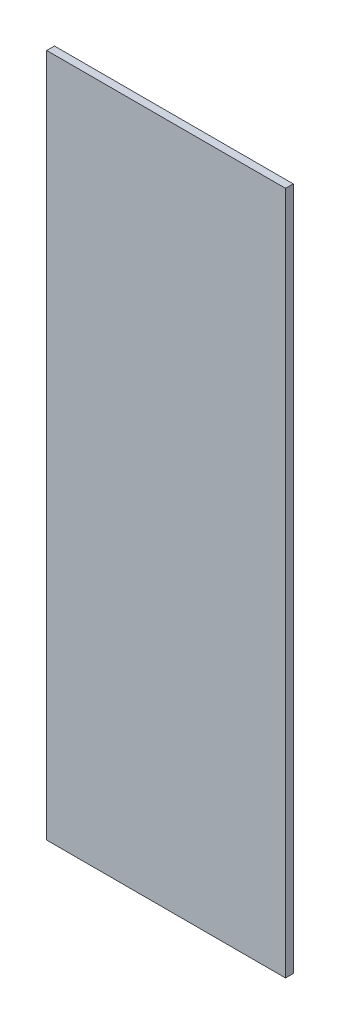
ISO-10303-21;
HEADER;
FILE_DESCRIPTION(('STEP AP214'),'2;1');
FILE_NAME('part.step','',(''),(''),'','','');
FILE_SCHEMA(('AUTOMOTIVE_DESIGN { 1 0 10303 214 1 1 1 1 }'));
ENDSEC;
DATA;
#1=APPLICATION_CONTEXT('core data for automotive mechanical design processes');
#2=APPLICATION_PROTOCOL_DEFINITION('international standard','automotive_design',2000,#1);
#3=PRODUCT_CONTEXT('',#1,'mechanical');
#4=PRODUCT('Part','Part','',(#3));
#5=PRODUCT_RELATED_PRODUCT_CATEGORY('part','',(#4));
#6=PRODUCT_DEFINITION_FORMATION('','',#4);
#7=PRODUCT_DEFINITION_CONTEXT('part definition',#1,'design');
#8=PRODUCT_DEFINITION('design','',#6,#7);
#9=PRODUCT_DEFINITION_SHAPE('','',#8);
#10=(LENGTH_UNIT() NAMED_UNIT(*) SI_UNIT(.MILLI.,.METRE.));
#11=(NAMED_UNIT(*) PLANE_ANGLE_UNIT() SI_UNIT($,.RADIAN.));
#12=(NAMED_UNIT(*) SI_UNIT($,.STERADIAN.) SOLID_ANGLE_UNIT());
#13=UNCERTAINTY_MEASURE_WITH_UNIT(LENGTH_MEASURE(1.E-05),#10,'distance_accuracy_value','');
#14=(GEOMETRIC_REPRESENTATION_CONTEXT(3) GLOBAL_UNCERTAINTY_ASSIGNED_CONTEXT((#13)) GLOBAL_UNIT_ASSIGNED_CONTEXT((#10,
#11,#12)) REPRESENTATION_CONTEXT('',''));
#15=CARTESIAN_POINT('',(0.,0.,0.));
#16=DIRECTION('',(0.,0.,1.));
#17=DIRECTION('',(1.,0.,0.));
#18=AXIS2_PLACEMENT_3D('',#15,#16,#17);
#19=CARTESIAN_POINT('',(41.5,201.5,-818.5));
#20=DIRECTION('',(-1.,0.,0.));
#21=DIRECTION('',(0.,0.,1.));
#22=AXIS2_PLACEMENT_3D('',#19,#20,#21);
#23=PLANE('',#22);
#24=DIRECTION('',(0.,-1.,0.));
#25=VECTOR('',#24,1.);
#26=CARTESIAN_POINT('',(41.5,201.5,-798.5));
#27=LINE('',#26,#25);
#28=CARTESIAN_POINT('',(41.5,1968.5,-798.5));
#29=VERTEX_POINT('',#28);
#30=CARTESIAN_POINT('',(41.5,201.5,-798.5));
#31=VERTEX_POINT('',#30);
#32=EDGE_CURVE('E103',#29,#31,#27,.T.);
#33=ORIENTED_EDGE('',*,*,#32,.F.);
#34=DIRECTION('',(0.,0.,1.));
#35=VECTOR('',#34,1.);
#36=CARTESIAN_POINT('',(41.5,1968.5,-818.5));
#37=LINE('',#36,#35);
#38=CARTESIAN_POINT('',(41.5,1968.5,-818.5));
#39=VERTEX_POINT('',#38);
#40=EDGE_CURVE('E11',#39,#29,#37,.T.);
#41=ORIENTED_EDGE('',*,*,#40,.F.);
#42=DIRECTION('',(0.,-1.,0.));
#43=VECTOR('',#42,1.);
#44=CARTESIAN_POINT('',(41.5,201.5,-818.5));
#45=LINE('',#44,#43);
#46=CARTESIAN_POINT('',(41.5,201.5,-818.5));
#47=VERTEX_POINT('',#46);
#48=EDGE_CURVE('E97',#39,#47,#45,.T.);
#49=ORIENTED_EDGE('',*,*,#48,.T.);
#50=DIRECTION('',(0.,0.,1.));
#51=VECTOR('',#50,1.);
#52=CARTESIAN_POINT('',(41.5,201.5,-818.5));
#53=LINE('',#52,#51);
#54=EDGE_CURVE('E42',#47,#31,#53,.T.);
#55=ORIENTED_EDGE('',*,*,#54,.T.);
#56=EDGE_LOOP('',(#33,#41,#49,#55));
#57=FACE_BOUND('',#56,.T.);
#58=ADVANCED_FACE('F39',(#57),#23,.T.);
#59=CARTESIAN_POINT('',(41.5,1968.5,-818.5));
#60=DIRECTION('',(0.,1.,0.));
#61=DIRECTION('',(0.,0.,1.));
#62=AXIS2_PLACEMENT_3D('',#59,#60,#61);
#63=PLANE('',#62);
#64=DIRECTION('',(-1.,0.,0.));
#65=VECTOR('',#64,1.);
#66=CARTESIAN_POINT('',(41.5,1968.5,-798.5));
#67=LINE('',#66,#65);
#68=CARTESIAN_POINT('',(658.5,1968.5,-798.5));
#69=VERTEX_POINT('',#68);
#70=EDGE_CURVE('E99',#69,#29,#67,.T.);
#71=ORIENTED_EDGE('',*,*,#70,.F.);
#72=DIRECTION('',(0.,0.,1.));
#73=VECTOR('',#72,1.);
#74=CARTESIAN_POINT('',(658.5,1968.5,-818.5));
#75=LINE('',#74,#73);
#76=CARTESIAN_POINT('',(658.5,1968.5,-818.5));
#77=VERTEX_POINT('',#76);
#78=EDGE_CURVE('E48',#77,#69,#75,.T.);
#79=ORIENTED_EDGE('',*,*,#78,.F.);
#80=DIRECTION('',(-1.,0.,0.));
#81=VECTOR('',#80,1.);
#82=CARTESIAN_POINT('',(41.5,1968.5,-818.5));
#83=LINE('',#82,#81);
#84=EDGE_CURVE('E94',#77,#39,#83,.T.);
#85=ORIENTED_EDGE('',*,*,#84,.T.);
#86=ORIENTED_EDGE('',*,*,#40,.T.);
#87=EDGE_LOOP('',(#71,#79,#85,#86));
#88=FACE_BOUND('',#87,.T.);
#89=ADVANCED_FACE('F113',(#88),#63,.T.);
#90=CARTESIAN_POINT('',(658.5,201.5,-818.5));
#91=DIRECTION('',(1.,0.,0.));
#92=DIRECTION('',(0.,0.,-1.));
#93=AXIS2_PLACEMENT_3D('',#90,#91,#92);
#94=PLANE('',#93);
#95=DIRECTION('',(0.,1.,0.));
#96=VECTOR('',#95,1.);
#97=CARTESIAN_POINT('',(658.5,201.5,-798.5));
#98=LINE('',#97,#96);
#99=CARTESIAN_POINT('',(658.5,201.5,-798.5));
#100=VERTEX_POINT('',#99);
#101=EDGE_CURVE('E89',#100,#69,#98,.T.);
#102=ORIENTED_EDGE('',*,*,#101,.F.);
#103=DIRECTION('',(0.,0.,1.));
#104=VECTOR('',#103,1.);
#105=CARTESIAN_POINT('',(658.5,201.5,-818.5));
#106=LINE('',#105,#104);
#107=CARTESIAN_POINT('',(658.5,201.5,-818.5));
#108=VERTEX_POINT('',#107);
#109=EDGE_CURVE('E84',#108,#100,#106,.T.);
#110=ORIENTED_EDGE('',*,*,#109,.F.);
#111=DIRECTION('',(0.,1.,0.));
#112=VECTOR('',#111,1.);
#113=CARTESIAN_POINT('',(658.5,201.5,-818.5));
#114=LINE('',#113,#112);
#115=EDGE_CURVE('E87',#108,#77,#114,.T.);
#116=ORIENTED_EDGE('',*,*,#115,.T.);
#117=ORIENTED_EDGE('',*,*,#78,.T.);
#118=EDGE_LOOP('',(#102,#110,#116,#117));
#119=FACE_BOUND('',#118,.T.);
#120=ADVANCED_FACE('F86',(#119),#94,.T.);
#121=CARTESIAN_POINT('',(41.5,201.5,-818.5));
#122=DIRECTION('',(0.,-1.,0.));
#123=DIRECTION('',(0.,0.,-1.));
#124=AXIS2_PLACEMENT_3D('',#121,#122,#123);
#125=PLANE('',#124);
#126=DIRECTION('',(1.,0.,0.));
#127=VECTOR('',#126,1.);
#128=CARTESIAN_POINT('',(41.5,201.5,-798.5));
#129=LINE('',#128,#127);
#130=EDGE_CURVE('E106',#31,#100,#129,.T.);
#131=ORIENTED_EDGE('',*,*,#130,.F.);
#132=ORIENTED_EDGE('',*,*,#54,.F.);
#133=DIRECTION('',(1.,0.,0.));
#134=VECTOR('',#133,1.);
#135=CARTESIAN_POINT('',(41.5,201.5,-818.5));
#136=LINE('',#135,#134);
#137=EDGE_CURVE('E93',#47,#108,#136,.T.);
#138=ORIENTED_EDGE('',*,*,#137,.T.);
#139=ORIENTED_EDGE('',*,*,#109,.T.);
#140=EDGE_LOOP('',(#131,#132,#138,#139));
#141=FACE_BOUND('',#140,.T.);
#142=ADVANCED_FACE('F96',(#141),#125,.T.);
#143=CARTESIAN_POINT('',(0.,0.,-818.5));
#144=DIRECTION('',(0.,0.,-1.));
#145=DIRECTION('',(-1.,0.,0.));
#146=AXIS2_PLACEMENT_3D('',#143,#144,#145);
#147=PLANE('',#146);
#148=ORIENTED_EDGE('',*,*,#48,.F.);
#149=ORIENTED_EDGE('',*,*,#84,.F.);
#150=ORIENTED_EDGE('',*,*,#115,.F.);
#151=ORIENTED_EDGE('',*,*,#137,.F.);
#152=EDGE_LOOP('',(#148,#149,#150,#151));
#153=FACE_BOUND('',#152,.T.);
#154=ADVANCED_FACE('F92',(#153),#147,.T.);
#155=CARTESIAN_POINT('',(0.,0.,-798.5));
#156=DIRECTION('',(0.,0.,-1.));
#157=DIRECTION('',(-1.,0.,0.));
#158=AXIS2_PLACEMENT_3D('',#155,#156,#157);
#159=PLANE('',#158);
#160=ORIENTED_EDGE('',*,*,#32,.T.);
#161=ORIENTED_EDGE('',*,*,#130,.T.);
#162=ORIENTED_EDGE('',*,*,#101,.T.);
#163=ORIENTED_EDGE('',*,*,#70,.T.);
#164=EDGE_LOOP('',(#160,#161,#162,#163));
#165=FACE_BOUND('',#164,.T.);
#166=ADVANCED_FACE('F112',(#165),#159,.F.);
#167=CLOSED_SHELL('',(#58,#89,#120,#142,#154,#166));
#168=MANIFOLD_SOLID_BREP('B2',#167);
#169=ADVANCED_BREP_SHAPE_REPRESENTATION('',(#18,#168),#14);
#170=SHAPE_DEFINITION_REPRESENTATION(#9,#169);
ENDSEC;
END-ISO-10303-21;
